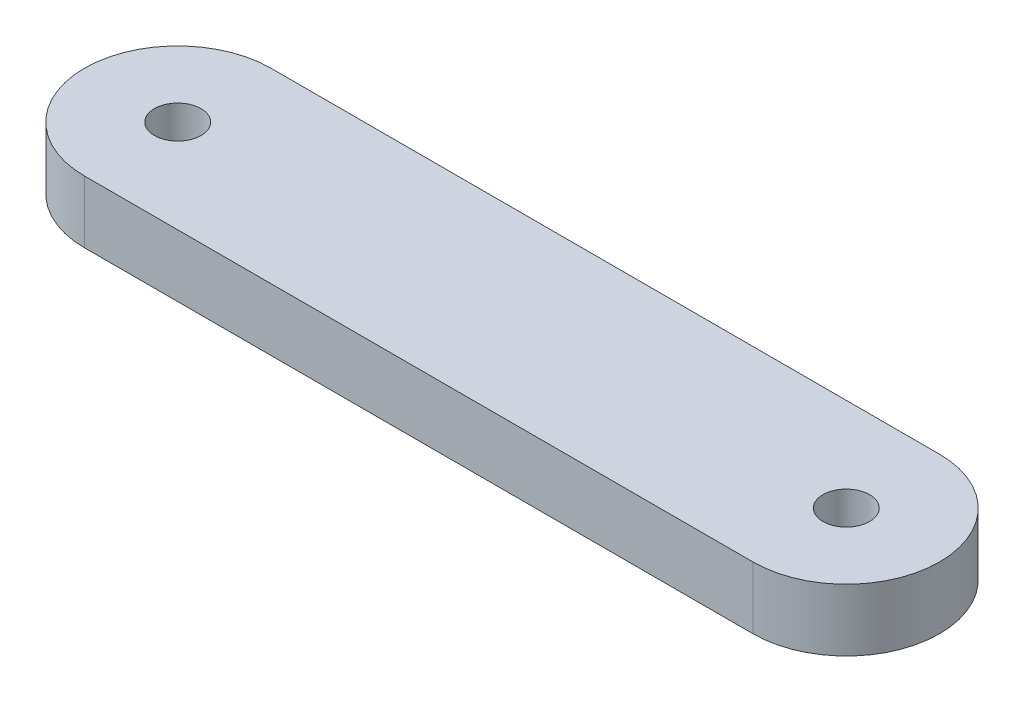
ISO-10303-21;
HEADER;
FILE_DESCRIPTION(('STEP AP214'),'2;1');
FILE_NAME('part.step','',(''),(''),'','','');
FILE_SCHEMA(('AUTOMOTIVE_DESIGN { 1 0 10303 214 1 1 1 1 }'));
ENDSEC;
DATA;
#1=APPLICATION_CONTEXT('core data for automotive mechanical design processes');
#2=APPLICATION_PROTOCOL_DEFINITION('international standard','automotive_design',2000,#1);
#3=PRODUCT_CONTEXT('',#1,'mechanical');
#4=PRODUCT('Part','Part','',(#3));
#5=PRODUCT_RELATED_PRODUCT_CATEGORY('part','',(#4));
#6=PRODUCT_DEFINITION_FORMATION('','',#4);
#7=PRODUCT_DEFINITION_CONTEXT('part definition',#1,'design');
#8=PRODUCT_DEFINITION('design','',#6,#7);
#9=PRODUCT_DEFINITION_SHAPE('','',#8);
#10=(LENGTH_UNIT() NAMED_UNIT(*) SI_UNIT(.MILLI.,.METRE.));
#11=(NAMED_UNIT(*) PLANE_ANGLE_UNIT() SI_UNIT($,.RADIAN.));
#12=(NAMED_UNIT(*) SI_UNIT($,.STERADIAN.) SOLID_ANGLE_UNIT());
#13=UNCERTAINTY_MEASURE_WITH_UNIT(LENGTH_MEASURE(1.E-05),#10,'distance_accuracy_value','');
#14=(GEOMETRIC_REPRESENTATION_CONTEXT(3) GLOBAL_UNCERTAINTY_ASSIGNED_CONTEXT((#13)) GLOBAL_UNIT_ASSIGNED_CONTEXT((#10,
#11,#12)) REPRESENTATION_CONTEXT('',''));
#15=CARTESIAN_POINT('',(0.,0.,0.));
#16=DIRECTION('',(0.,0.,1.));
#17=DIRECTION('',(1.,0.,0.));
#18=AXIS2_PLACEMENT_3D('',#15,#16,#17);
#19=CARTESIAN_POINT('',(-21.5,4.,0.));
#20=DIRECTION('',(0.,1.,0.));
#21=DIRECTION('',(0.,0.,1.));
#22=AXIS2_PLACEMENT_3D('',#19,#20,#21);
#23=PLANE('',#22);
#24=CARTESIAN_POINT('',(-21.5,4.,0.));
#25=DIRECTION('',(0.,1.,0.));
#26=DIRECTION('',(0.,0.,1.));
#27=AXIS2_PLACEMENT_3D('',#24,#25,#26);
#28=CIRCLE('',#27,1.5);
#29=CARTESIAN_POINT('',(-21.5,4.,1.5));
#30=VERTEX_POINT('',#29);
#31=EDGE_CURVE('E102',#30,#30,#28,.T.);
#32=ORIENTED_EDGE('',*,*,#31,.F.);
#33=EDGE_LOOP('',(#32));
#34=FACE_BOUND('',#33,.T.);
#35=CARTESIAN_POINT('',(-21.5,4.,0.));
#36=DIRECTION('',(0.,1.,0.));
#37=DIRECTION('',(0.,0.,1.));
#38=AXIS2_PLACEMENT_3D('',#35,#36,#37);
#39=CIRCLE('',#38,6.);
#40=CARTESIAN_POINT('',(-21.5,4.,-6.));
#41=VERTEX_POINT('',#40);
#42=CARTESIAN_POINT('',(-21.5,4.,6.));
#43=VERTEX_POINT('',#42);
#44=EDGE_CURVE('E87',#41,#43,#39,.T.);
#45=ORIENTED_EDGE('',*,*,#44,.T.);
#46=DIRECTION('',(1.,0.,0.));
#47=VECTOR('',#46,1.);
#48=CARTESIAN_POINT('',(-21.5,4.,6.));
#49=LINE('',#48,#47);
#50=CARTESIAN_POINT('',(21.5,4.,5.99999999999999));
#51=VERTEX_POINT('',#50);
#52=EDGE_CURVE('E82',#43,#51,#49,.T.);
#53=ORIENTED_EDGE('',*,*,#52,.T.);
#54=CARTESIAN_POINT('',(21.5,4.,0.));
#55=DIRECTION('',(0.,1.,0.));
#56=DIRECTION('',(0.,0.,1.));
#57=AXIS2_PLACEMENT_3D('',#54,#55,#56);
#58=CIRCLE('',#57,6.);
#59=CARTESIAN_POINT('',(21.5,4.,-6.00000000000001));
#60=VERTEX_POINT('',#59);
#61=EDGE_CURVE('E85',#51,#60,#58,.T.);
#62=ORIENTED_EDGE('',*,*,#61,.T.);
#63=DIRECTION('',(-1.,0.,0.));
#64=VECTOR('',#63,1.);
#65=CARTESIAN_POINT('',(-21.5,4.,-6.));
#66=LINE('',#65,#64);
#67=EDGE_CURVE('E52',#60,#41,#66,.T.);
#68=ORIENTED_EDGE('',*,*,#67,.T.);
#69=EDGE_LOOP('',(#45,#53,#62,#68));
#70=FACE_BOUND('',#69,.T.);
#71=CARTESIAN_POINT('',(21.5,4.,0.));
#72=DIRECTION('',(0.,1.,0.));
#73=DIRECTION('',(0.,0.,1.));
#74=AXIS2_PLACEMENT_3D('',#71,#72,#73);
#75=CIRCLE('',#74,1.5);
#76=CARTESIAN_POINT('',(21.5,4.,1.5));
#77=VERTEX_POINT('',#76);
#78=EDGE_CURVE('E117',#77,#77,#75,.T.);
#79=ORIENTED_EDGE('',*,*,#78,.F.);
#80=EDGE_LOOP('',(#79));
#81=FACE_BOUND('',#80,.T.);
#82=ADVANCED_FACE('F35',(#34,#70,#81),#23,.T.);
#83=CARTESIAN_POINT('',(-21.5,0.,0.));
#84=DIRECTION('',(0.,1.,0.));
#85=DIRECTION('',(0.,0.,1.));
#86=AXIS2_PLACEMENT_3D('',#83,#84,#85);
#87=PLANE('',#86);
#88=CARTESIAN_POINT('',(-21.5,0.,0.));
#89=DIRECTION('',(0.,1.,0.));
#90=DIRECTION('',(0.,0.,1.));
#91=AXIS2_PLACEMENT_3D('',#88,#89,#90);
#92=CIRCLE('',#91,6.);
#93=CARTESIAN_POINT('',(-21.5,0.,-6.));
#94=VERTEX_POINT('',#93);
#95=CARTESIAN_POINT('',(-21.5,0.,6.));
#96=VERTEX_POINT('',#95);
#97=EDGE_CURVE('E99',#94,#96,#92,.T.);
#98=ORIENTED_EDGE('',*,*,#97,.F.);
#99=DIRECTION('',(-1.,0.,0.));
#100=VECTOR('',#99,1.);
#101=CARTESIAN_POINT('',(-21.5,0.,-6.));
#102=LINE('',#101,#100);
#103=CARTESIAN_POINT('',(21.5,0.,-6.00000000000001));
#104=VERTEX_POINT('',#103);
#105=EDGE_CURVE('E75',#104,#94,#102,.T.);
#106=ORIENTED_EDGE('',*,*,#105,.F.);
#107=CARTESIAN_POINT('',(21.5,0.,0.));
#108=DIRECTION('',(0.,1.,0.));
#109=DIRECTION('',(0.,0.,1.));
#110=AXIS2_PLACEMENT_3D('',#107,#108,#109);
#111=CIRCLE('',#110,6.);
#112=CARTESIAN_POINT('',(21.5,0.,5.99999999999999));
#113=VERTEX_POINT('',#112);
#114=EDGE_CURVE('E69',#113,#104,#111,.T.);
#115=ORIENTED_EDGE('',*,*,#114,.F.);
#116=DIRECTION('',(1.,0.,0.));
#117=VECTOR('',#116,1.);
#118=CARTESIAN_POINT('',(-21.5,0.,6.));
#119=LINE('',#118,#117);
#120=EDGE_CURVE('E91',#96,#113,#119,.T.);
#121=ORIENTED_EDGE('',*,*,#120,.F.);
#122=EDGE_LOOP('',(#98,#106,#115,#121));
#123=FACE_BOUND('',#122,.T.);
#124=CARTESIAN_POINT('',(-21.5,0.,0.));
#125=DIRECTION('',(0.,1.,0.));
#126=DIRECTION('',(0.,0.,1.));
#127=AXIS2_PLACEMENT_3D('',#124,#125,#126);
#128=CIRCLE('',#127,1.5);
#129=CARTESIAN_POINT('',(-21.5,0.,1.5));
#130=VERTEX_POINT('',#129);
#131=EDGE_CURVE('E114',#130,#130,#128,.T.);
#132=ORIENTED_EDGE('',*,*,#131,.T.);
#133=EDGE_LOOP('',(#132));
#134=FACE_BOUND('',#133,.T.);
#135=CARTESIAN_POINT('',(21.5,0.,0.));
#136=DIRECTION('',(0.,1.,0.));
#137=DIRECTION('',(0.,0.,1.));
#138=AXIS2_PLACEMENT_3D('',#135,#136,#137);
#139=CIRCLE('',#138,1.5);
#140=CARTESIAN_POINT('',(21.5,0.,1.5));
#141=VERTEX_POINT('',#140);
#142=EDGE_CURVE('E120',#141,#141,#139,.T.);
#143=ORIENTED_EDGE('',*,*,#142,.T.);
#144=EDGE_LOOP('',(#143));
#145=FACE_BOUND('',#144,.T.);
#146=ADVANCED_FACE('F110',(#123,#134,#145),#87,.F.);
#147=CARTESIAN_POINT('',(-21.5,4.,0.));
#148=DIRECTION('',(0.,-1.,0.));
#149=DIRECTION('',(0.,0.,-1.));
#150=AXIS2_PLACEMENT_3D('',#147,#148,#149);
#151=CYLINDRICAL_SURFACE('',#150,6.);
#152=ORIENTED_EDGE('',*,*,#97,.T.);
#153=DIRECTION('',(0.,-1.,0.));
#154=VECTOR('',#153,1.);
#155=CARTESIAN_POINT('',(-21.5,4.,6.));
#156=LINE('',#155,#154);
#157=EDGE_CURVE('E11',#43,#96,#156,.T.);
#158=ORIENTED_EDGE('',*,*,#157,.F.);
#159=ORIENTED_EDGE('',*,*,#44,.F.);
#160=DIRECTION('',(0.,-1.,0.));
#161=VECTOR('',#160,1.);
#162=CARTESIAN_POINT('',(-21.5,4.,-6.));
#163=LINE('',#162,#161);
#164=EDGE_CURVE('E95',#41,#94,#163,.T.);
#165=ORIENTED_EDGE('',*,*,#164,.T.);
#166=EDGE_LOOP('',(#152,#158,#159,#165));
#167=FACE_BOUND('',#166,.T.);
#168=ADVANCED_FACE('F37',(#167),#151,.T.);
#169=CARTESIAN_POINT('',(-21.5,4.,6.));
#170=DIRECTION('',(0.,0.,-1.));
#171=DIRECTION('',(-1.,0.,0.));
#172=AXIS2_PLACEMENT_3D('',#169,#170,#171);
#173=PLANE('',#172);
#174=ORIENTED_EDGE('',*,*,#120,.T.);
#175=DIRECTION('',(0.,-1.,0.));
#176=VECTOR('',#175,1.);
#177=CARTESIAN_POINT('',(21.5,4.,5.99999999999999));
#178=LINE('',#177,#176);
#179=EDGE_CURVE('E44',#51,#113,#178,.T.);
#180=ORIENTED_EDGE('',*,*,#179,.F.);
#181=ORIENTED_EDGE('',*,*,#52,.F.);
#182=ORIENTED_EDGE('',*,*,#157,.T.);
#183=EDGE_LOOP('',(#174,#180,#181,#182));
#184=FACE_BOUND('',#183,.T.);
#185=ADVANCED_FACE('F90',(#184),#173,.F.);
#186=CARTESIAN_POINT('',(21.5,4.,0.));
#187=DIRECTION('',(0.,-1.,0.));
#188=DIRECTION('',(0.,0.,-1.));
#189=AXIS2_PLACEMENT_3D('',#186,#187,#188);
#190=CYLINDRICAL_SURFACE('',#189,6.);
#191=ORIENTED_EDGE('',*,*,#114,.T.);
#192=DIRECTION('',(0.,-1.,0.));
#193=VECTOR('',#192,1.);
#194=CARTESIAN_POINT('',(21.5,4.,-6.00000000000001));
#195=LINE('',#194,#193);
#196=EDGE_CURVE('E92',#60,#104,#195,.T.);
#197=ORIENTED_EDGE('',*,*,#196,.F.);
#198=ORIENTED_EDGE('',*,*,#61,.F.);
#199=ORIENTED_EDGE('',*,*,#179,.T.);
#200=EDGE_LOOP('',(#191,#197,#198,#199));
#201=FACE_BOUND('',#200,.T.);
#202=ADVANCED_FACE('F93',(#201),#190,.T.);
#203=CARTESIAN_POINT('',(-21.5,4.,-6.));
#204=DIRECTION('',(0.,0.,1.));
#205=DIRECTION('',(1.,0.,0.));
#206=AXIS2_PLACEMENT_3D('',#203,#204,#205);
#207=PLANE('',#206);
#208=ORIENTED_EDGE('',*,*,#105,.T.);
#209=ORIENTED_EDGE('',*,*,#164,.F.);
#210=ORIENTED_EDGE('',*,*,#67,.F.);
#211=ORIENTED_EDGE('',*,*,#196,.T.);
#212=EDGE_LOOP('',(#208,#209,#210,#211));
#213=FACE_BOUND('',#212,.T.);
#214=ADVANCED_FACE('F107',(#213),#207,.F.);
#215=CARTESIAN_POINT('',(-21.5,4.,0.));
#216=DIRECTION('',(0.,-1.,0.));
#217=DIRECTION('',(0.,0.,-1.));
#218=AXIS2_PLACEMENT_3D('',#215,#216,#217);
#219=CYLINDRICAL_SURFACE('',#218,1.5);
#220=ORIENTED_EDGE('',*,*,#31,.T.);
#221=EDGE_LOOP('',(#220));
#222=FACE_BOUND('',#221,.T.);
#223=ORIENTED_EDGE('',*,*,#131,.F.);
#224=EDGE_LOOP('',(#223));
#225=FACE_BOUND('',#224,.T.);
#226=ADVANCED_FACE('F137',(#222,#225),#219,.F.);
#227=CARTESIAN_POINT('',(21.5,4.,0.));
#228=DIRECTION('',(0.,-1.,0.));
#229=DIRECTION('',(0.,0.,-1.));
#230=AXIS2_PLACEMENT_3D('',#227,#228,#229);
#231=CYLINDRICAL_SURFACE('',#230,1.5);
#232=ORIENTED_EDGE('',*,*,#78,.T.);
#233=EDGE_LOOP('',(#232));
#234=FACE_BOUND('',#233,.T.);
#235=ORIENTED_EDGE('',*,*,#142,.F.);
#236=EDGE_LOOP('',(#235));
#237=FACE_BOUND('',#236,.T.);
#238=ADVANCED_FACE('F126',(#234,#237),#231,.F.);
#239=CLOSED_SHELL('',(#82,#146,#168,#185,#202,#214,#226,#238));
#240=MANIFOLD_SOLID_BREP('B2',#239);
#241=ADVANCED_BREP_SHAPE_REPRESENTATION('',(#18,#240),#14);
#242=SHAPE_DEFINITION_REPRESENTATION(#9,#241);
ENDSEC;
END-ISO-10303-21;
